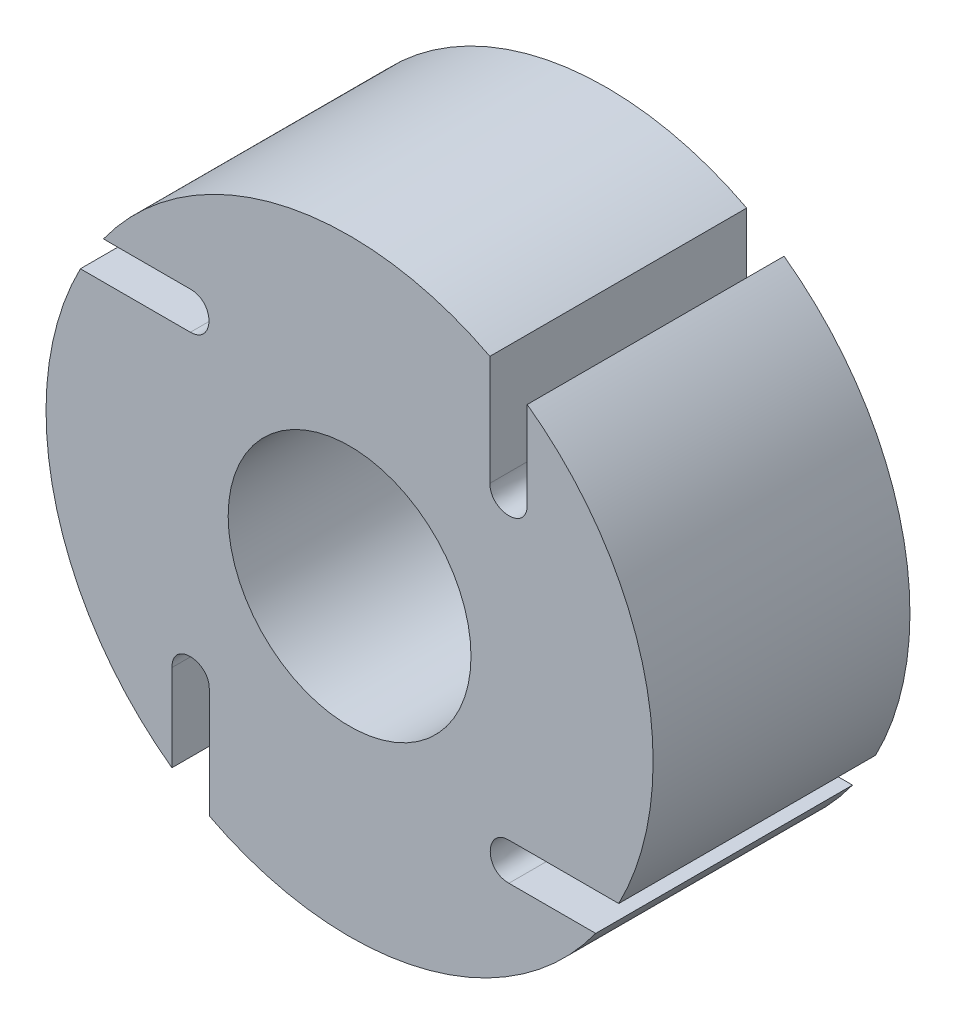
ISO-10303-21;
HEADER;
FILE_DESCRIPTION(('STEP AP214'),'2;1');
FILE_NAME('part.step','',(''),(''),'','','');
FILE_SCHEMA(('AUTOMOTIVE_DESIGN { 1 0 10303 214 1 1 1 1 }'));
ENDSEC;
DATA;
#1=APPLICATION_CONTEXT('core data for automotive mechanical design processes');
#2=APPLICATION_PROTOCOL_DEFINITION('international standard','automotive_design',2000,#1);
#3=PRODUCT_CONTEXT('',#1,'mechanical');
#4=PRODUCT('Part','Part','',(#3));
#5=PRODUCT_RELATED_PRODUCT_CATEGORY('part','',(#4));
#6=PRODUCT_DEFINITION_FORMATION('','',#4);
#7=PRODUCT_DEFINITION_CONTEXT('part definition',#1,'design');
#8=PRODUCT_DEFINITION('design','',#6,#7);
#9=PRODUCT_DEFINITION_SHAPE('','',#8);
#10=(LENGTH_UNIT() NAMED_UNIT(*) SI_UNIT(.MILLI.,.METRE.));
#11=(NAMED_UNIT(*) PLANE_ANGLE_UNIT() SI_UNIT($,.RADIAN.));
#12=(NAMED_UNIT(*) SI_UNIT($,.STERADIAN.) SOLID_ANGLE_UNIT());
#13=UNCERTAINTY_MEASURE_WITH_UNIT(LENGTH_MEASURE(1.E-05),#10,'distance_accuracy_value','');
#14=(GEOMETRIC_REPRESENTATION_CONTEXT(3) GLOBAL_UNCERTAINTY_ASSIGNED_CONTEXT((#13)) GLOBAL_UNIT_ASSIGNED_CONTEXT((#10,
#11,#12)) REPRESENTATION_CONTEXT('',''));
#15=CARTESIAN_POINT('',(0.,0.,0.));
#16=DIRECTION('',(0.,0.,1.));
#17=DIRECTION('',(1.,0.,0.));
#18=AXIS2_PLACEMENT_3D('',#15,#16,#17);
#19=CARTESIAN_POINT('',(7.16553890691274,7.3119658807004,-5.5));
#20=DIRECTION('',(0.,0.,1.));
#21=DIRECTION('',(1.,0.,0.));
#22=AXIS2_PLACEMENT_3D('',#19,#20,#21);
#23=CYLINDRICAL_SURFACE('',#22,6.5);
#24=DIRECTION('',(0.,0.,1.));
#25=VECTOR('',#24,1.);
#26=CARTESIAN_POINT('',(1.8949195940443,11.1159863931081,-5.5));
#27=LINE('',#26,#25);
#28=CARTESIAN_POINT('',(1.8949195940443,11.1159863931081,0.));
#29=VERTEX_POINT('',#28);
#30=CARTESIAN_POINT('',(1.8949195940443,11.1159863931081,-5.5));
#31=VERTEX_POINT('',#30);
#32=EDGE_CURVE('E217',#29,#31,#27,.F.);
#33=ORIENTED_EDGE('',*,*,#32,.F.);
#34=CARTESIAN_POINT('',(7.16553890691274,7.3119658807004,0.));
#35=DIRECTION('',(0.,0.,1.));
#36=DIRECTION('',(1.,0.,0.));
#37=AXIS2_PLACEMENT_3D('',#34,#35,#36);
#38=CIRCLE('',#37,6.5);
#39=CARTESIAN_POINT('',(10.1695594193204,13.0761536605211,0.));
#40=VERTEX_POINT('',#39);
#41=EDGE_CURVE('E317',#40,#29,#38,.T.);
#42=ORIENTED_EDGE('',*,*,#41,.F.);
#43=DIRECTION('',(0.,0.,1.));
#44=VECTOR('',#43,1.);
#45=CARTESIAN_POINT('',(10.1695594193204,13.0761536605211,-5.5));
#46=LINE('',#45,#44);
#47=CARTESIAN_POINT('',(10.1695594193204,13.0761536605211,-5.5));
#48=VERTEX_POINT('',#47);
#49=EDGE_CURVE('E298',#48,#40,#46,.T.);
#50=ORIENTED_EDGE('',*,*,#49,.F.);
#51=CARTESIAN_POINT('',(7.16553890691274,7.3119658807004,-5.5));
#52=DIRECTION('',(0.,0.,1.));
#53=DIRECTION('',(1.,0.,0.));
#54=AXIS2_PLACEMENT_3D('',#51,#52,#53);
#55=CIRCLE('',#54,6.5);
#56=EDGE_CURVE('E312',#48,#31,#55,.T.);
#57=ORIENTED_EDGE('',*,*,#56,.T.);
#58=EDGE_LOOP('',(#33,#42,#50,#57));
#59=FACE_BOUND('',#58,.T.);
#60=ADVANCED_FACE('F33',(#59),#23,.T.);
#61=DIRECTION('',(0.,0.,1.));
#62=VECTOR('',#61,1.);
#63=CARTESIAN_POINT('',(1.40135112709207,10.3159863931081,-5.5));
#64=LINE('',#63,#62);
#65=CARTESIAN_POINT('',(1.40135112709207,10.3159863931081,-5.5));
#66=VERTEX_POINT('',#65);
#67=CARTESIAN_POINT('',(1.40135112709207,10.3159863931081,0.));
#68=VERTEX_POINT('',#67);
#69=EDGE_CURVE('E47',#66,#68,#64,.T.);
#70=ORIENTED_EDGE('',*,*,#69,.F.);
#71=CARTESIAN_POINT('',(3.3615183945051,2.04134656783195,-5.5));
#72=VERTEX_POINT('',#71);
#73=EDGE_CURVE('E164',#66,#72,#55,.T.);
#74=ORIENTED_EDGE('',*,*,#73,.T.);
#75=DIRECTION('',(0.,0.,1.));
#76=VECTOR('',#75,1.);
#77=CARTESIAN_POINT('',(3.3615183945051,2.04134656783195,-5.5));
#78=LINE('',#77,#76);
#79=CARTESIAN_POINT('',(3.3615183945051,2.04134656783195,0.));
#80=VERTEX_POINT('',#79);
#81=EDGE_CURVE('E228',#80,#72,#78,.F.);
#82=ORIENTED_EDGE('',*,*,#81,.F.);
#83=EDGE_CURVE('E320',#68,#80,#38,.T.);
#84=ORIENTED_EDGE('',*,*,#83,.F.);
#85=EDGE_LOOP('',(#70,#74,#82,#84));
#86=FACE_BOUND('',#85,.T.);
#87=ADVANCED_FACE('F336',(#86),#23,.T.);
#88=DIRECTION('',(0.,0.,1.));
#89=VECTOR('',#88,1.);
#90=CARTESIAN_POINT('',(4.1615183945051,1.54777810087971,-5.5));
#91=LINE('',#90,#89);
#92=CARTESIAN_POINT('',(4.1615183945051,1.54777810087971,-5.5));
#93=VERTEX_POINT('',#92);
#94=CARTESIAN_POINT('',(4.1615183945051,1.54777810087971,0.));
#95=VERTEX_POINT('',#94);
#96=EDGE_CURVE('E55',#93,#95,#91,.T.);
#97=ORIENTED_EDGE('',*,*,#96,.F.);
#98=CARTESIAN_POINT('',(12.4361582197811,3.50794536829269,-5.5));
#99=VERTEX_POINT('',#98);
#100=EDGE_CURVE('E337',#93,#99,#55,.T.);
#101=ORIENTED_EDGE('',*,*,#100,.T.);
#102=DIRECTION('',(0.,0.,1.));
#103=VECTOR('',#102,1.);
#104=CARTESIAN_POINT('',(12.4361582197811,3.50794536829269,-5.5));
#105=LINE('',#104,#103);
#106=CARTESIAN_POINT('',(12.4361582197811,3.50794536829269,0.));
#107=VERTEX_POINT('',#106);
#108=EDGE_CURVE('E290',#107,#99,#105,.F.);
#109=ORIENTED_EDGE('',*,*,#108,.F.);
#110=EDGE_CURVE('E357',#95,#107,#38,.T.);
#111=ORIENTED_EDGE('',*,*,#110,.F.);
#112=EDGE_LOOP('',(#97,#101,#109,#111));
#113=FACE_BOUND('',#112,.T.);
#114=ADVANCED_FACE('F366',(#113),#23,.T.);
#115=DIRECTION('',(0.,0.,1.));
#116=VECTOR('',#115,1.);
#117=CARTESIAN_POINT('',(12.9297266867334,4.30794536829269,-5.5));
#118=LINE('',#117,#116);
#119=CARTESIAN_POINT('',(12.9297266867334,4.30794536829269,-5.5));
#120=VERTEX_POINT('',#119);
#121=CARTESIAN_POINT('',(12.9297266867334,4.30794536829269,0.));
#122=VERTEX_POINT('',#121);
#123=EDGE_CURVE('E347',#120,#122,#118,.T.);
#124=ORIENTED_EDGE('',*,*,#123,.F.);
#125=CARTESIAN_POINT('',(10.9695594193204,12.5825851935688,-5.5));
#126=VERTEX_POINT('',#125);
#127=EDGE_CURVE('E316',#120,#126,#55,.T.);
#128=ORIENTED_EDGE('',*,*,#127,.T.);
#129=DIRECTION('',(0.,0.,1.));
#130=VECTOR('',#129,1.);
#131=CARTESIAN_POINT('',(10.9695594193204,12.5825851935688,-5.5));
#132=LINE('',#131,#130);
#133=CARTESIAN_POINT('',(10.9695594193204,12.5825851935688,0.));
#134=VERTEX_POINT('',#133);
#135=EDGE_CURVE('E302',#134,#126,#132,.F.);
#136=ORIENTED_EDGE('',*,*,#135,.F.);
#137=EDGE_CURVE('E309',#122,#134,#38,.T.);
#138=ORIENTED_EDGE('',*,*,#137,.F.);
#139=EDGE_LOOP('',(#124,#128,#136,#138));
#140=FACE_BOUND('',#139,.T.);
#141=ADVANCED_FACE('F35',(#140),#23,.T.);
#142=CARTESIAN_POINT('',(7.16553890691274,7.3119658807004,-5.5));
#143=DIRECTION('',(0.,0.,1.));
#144=DIRECTION('',(1.,0.,0.));
#145=AXIS2_PLACEMENT_3D('',#142,#143,#144);
#146=PLANE('',#145);
#147=CARTESIAN_POINT('',(7.16553890691274,7.3119658807004,-5.5));
#148=DIRECTION('',(0.,0.,1.));
#149=DIRECTION('',(1.,0.,0.));
#150=AXIS2_PLACEMENT_3D('',#147,#148,#149);
#151=CIRCLE('',#150,2.6);
#152=CARTESIAN_POINT('',(9.76553890691274,7.3119658807004,-5.5));
#153=VERTEX_POINT('',#152);
#154=EDGE_CURVE('E306',#153,#153,#151,.T.);
#155=ORIENTED_EDGE('',*,*,#154,.T.);
#156=EDGE_LOOP('',(#155));
#157=FACE_BOUND('',#156,.T.);
#158=CARTESIAN_POINT('',(3.7563901333758,10.315986393108,-5.5));
#159=CARTESIAN_POINT('',(4.26558371174285,10.315986393108,-5.5));
#160=CARTESIAN_POINT('',(4.3066364519543,11.115986393108,-5.5));
#161=CARTESIAN_POINT('',(3.75373354022195,11.115986393108,-5.5));
#162=B_SPLINE_CURVE_WITH_KNOTS('',3,(#158,#159,#160,#161),.UNSPECIFIED.,.F.,.F.,(4,4),(0.,1.),.UNSPECIFIED.);
#163=CARTESIAN_POINT('',(3.7563901333758,10.315986393108,-5.5));
#164=VERTEX_POINT('',#163);
#165=CARTESIAN_POINT('',(3.75373354022198,11.115986393108,-5.5));
#166=VERTEX_POINT('',#165);
#167=EDGE_CURVE('E155',#164,#166,#162,.T.);
#168=ORIENTED_EDGE('',*,*,#167,.T.);
#169=DIRECTION('',(-1.,0.,0.));
#170=VECTOR('',#169,1.);
#171=CARTESIAN_POINT('',(3.75373354022198,11.115986393108,-5.5));
#172=LINE('',#171,#170);
#173=EDGE_CURVE('E152',#166,#31,#172,.T.);
#174=ORIENTED_EDGE('',*,*,#173,.T.);
#175=ORIENTED_EDGE('',*,*,#56,.F.);
#176=DIRECTION('',(0.,-1.,0.));
#177=VECTOR('',#176,1.);
#178=CARTESIAN_POINT('',(10.1695594193204,13.2154913280105,-5.5));
#179=LINE('',#178,#177);
#180=CARTESIAN_POINT('',(10.1695594193204,10.7211146542373,-5.5));
#181=VERTEX_POINT('',#180);
#182=EDGE_CURVE('E276',#48,#181,#179,.T.);
#183=ORIENTED_EDGE('',*,*,#182,.T.);
#184=CARTESIAN_POINT('',(10.1695594193204,10.7211146542373,-5.5));
#185=CARTESIAN_POINT('',(10.1695594193204,10.2119210758703,-5.5));
#186=CARTESIAN_POINT('',(10.9695594193204,10.1708683356588,-5.5));
#187=CARTESIAN_POINT('',(10.9695594193204,10.7237712473912,-5.5));
#188=B_SPLINE_CURVE_WITH_KNOTS('',3,(#184,#185,#186,#187),.UNSPECIFIED.,.F.,.F.,(4,4),(0.,1.),.UNSPECIFIED.);
#189=CARTESIAN_POINT('',(10.9695594193204,10.7237712473912,-5.5));
#190=VERTEX_POINT('',#189);
#191=EDGE_CURVE('E268',#181,#190,#188,.T.);
#192=ORIENTED_EDGE('',*,*,#191,.T.);
#193=DIRECTION('',(0.,1.,0.));
#194=VECTOR('',#193,1.);
#195=CARTESIAN_POINT('',(10.9695594193204,10.7237712473912,-5.5));
#196=LINE('',#195,#194);
#197=EDGE_CURVE('E275',#190,#126,#196,.T.);
#198=ORIENTED_EDGE('',*,*,#197,.T.);
#199=ORIENTED_EDGE('',*,*,#127,.F.);
#200=DIRECTION('',(-1.,0.,0.));
#201=VECTOR('',#200,1.);
#202=CARTESIAN_POINT('',(13.0690643542229,4.30794536829269,-5.5));
#203=LINE('',#202,#201);
#204=CARTESIAN_POINT('',(10.5746876804498,4.30794536829271,-5.5));
#205=VERTEX_POINT('',#204);
#206=EDGE_CURVE('E232',#120,#205,#203,.T.);
#207=ORIENTED_EDGE('',*,*,#206,.T.);
#208=CARTESIAN_POINT('',(10.5746876804498,4.30794536829271,-5.5));
#209=CARTESIAN_POINT('',(10.0654941020827,4.30794536829271,-5.5));
#210=CARTESIAN_POINT('',(10.0244413618713,3.50794536829271,-5.5));
#211=CARTESIAN_POINT('',(10.5773442736036,3.50794536829271,-5.5));
#212=B_SPLINE_CURVE_WITH_KNOTS('',3,(#208,#209,#210,#211),.UNSPECIFIED.,.F.,.F.,(4,4),(0.,1.),.UNSPECIFIED.);
#213=CARTESIAN_POINT('',(10.5773442736036,3.5079453682927,-5.5));
#214=VERTEX_POINT('',#213);
#215=EDGE_CURVE('E235',#205,#214,#212,.T.);
#216=ORIENTED_EDGE('',*,*,#215,.T.);
#217=DIRECTION('',(1.,0.,0.));
#218=VECTOR('',#217,1.);
#219=CARTESIAN_POINT('',(10.5773442736036,3.5079453682927,-5.5));
#220=LINE('',#219,#218);
#221=EDGE_CURVE('E242',#214,#99,#220,.T.);
#222=ORIENTED_EDGE('',*,*,#221,.T.);
#223=ORIENTED_EDGE('',*,*,#100,.F.);
#224=DIRECTION('',(0.,1.,0.));
#225=VECTOR('',#224,1.);
#226=CARTESIAN_POINT('',(4.1615183945051,1.40844043339028,-5.5));
#227=LINE('',#226,#225);
#228=CARTESIAN_POINT('',(4.16151839450514,3.90281710716338,-5.5));
#229=VERTEX_POINT('',#228);
#230=EDGE_CURVE('E204',#93,#229,#227,.T.);
#231=ORIENTED_EDGE('',*,*,#230,.T.);
#232=CARTESIAN_POINT('',(4.16151839450514,3.90281710716338,-5.5));
#233=CARTESIAN_POINT('',(4.16151839450514,4.41201068553042,-5.5));
#234=CARTESIAN_POINT('',(3.36151839450514,4.45306342574187,-5.5));
#235=CARTESIAN_POINT('',(3.36151839450514,3.90016051400952,-5.5));
#236=B_SPLINE_CURVE_WITH_KNOTS('',3,(#232,#233,#234,#235),.UNSPECIFIED.,.F.,.F.,(4,4),(0.,1.),.UNSPECIFIED.);
#237=CARTESIAN_POINT('',(3.36151839450512,3.90016051400955,-5.5));
#238=VERTEX_POINT('',#237);
#239=EDGE_CURVE('E196',#229,#238,#236,.T.);
#240=ORIENTED_EDGE('',*,*,#239,.T.);
#241=DIRECTION('',(0.,-1.,0.));
#242=VECTOR('',#241,1.);
#243=CARTESIAN_POINT('',(3.36151839450512,3.90016051400955,-5.5));
#244=LINE('',#243,#242);
#245=EDGE_CURVE('E203',#238,#72,#244,.T.);
#246=ORIENTED_EDGE('',*,*,#245,.T.);
#247=ORIENTED_EDGE('',*,*,#73,.F.);
#248=DIRECTION('',(1.,0.,0.));
#249=VECTOR('',#248,1.);
#250=CARTESIAN_POINT('',(1.26201345960271,10.3159863931081,-5.5));
#251=LINE('',#250,#249);
#252=EDGE_CURVE('E147',#66,#164,#251,.T.);
#253=ORIENTED_EDGE('',*,*,#252,.T.);
#254=EDGE_LOOP('',(#168,#174,#175,#183,#192,#198,#199,#207,#216,#222,#223,#231,#240,#246,#247,#253));
#255=FACE_BOUND('',#254,.T.);
#256=ADVANCED_FACE('F162',(#157,#255),#146,.F.);
#257=CARTESIAN_POINT('',(7.16553890691274,7.3119658807004,0.));
#258=DIRECTION('',(0.,0.,1.));
#259=DIRECTION('',(1.,0.,0.));
#260=AXIS2_PLACEMENT_3D('',#257,#258,#259);
#261=PLANE('',#260);
#262=DIRECTION('',(-1.,0.,0.));
#263=VECTOR('',#262,1.);
#264=CARTESIAN_POINT('',(3.75373354022198,11.115986393108,0.));
#265=LINE('',#264,#263);
#266=CARTESIAN_POINT('',(3.75373354022198,11.115986393108,0.));
#267=VERTEX_POINT('',#266);
#268=EDGE_CURVE('E165',#267,#29,#265,.T.);
#269=ORIENTED_EDGE('',*,*,#268,.F.);
#270=CARTESIAN_POINT('',(3.7563901333758,10.315986393108,0.));
#271=CARTESIAN_POINT('',(4.26558371174285,10.315986393108,0.));
#272=CARTESIAN_POINT('',(4.3066364519543,11.115986393108,0.));
#273=CARTESIAN_POINT('',(3.75373354022195,11.115986393108,0.));
#274=B_SPLINE_CURVE_WITH_KNOTS('',3,(#270,#271,#272,#273),.UNSPECIFIED.,.F.,.F.,(4,4),(0.,1.),.UNSPECIFIED.);
#275=CARTESIAN_POINT('',(3.7563901333758,10.315986393108,0.));
#276=VERTEX_POINT('',#275);
#277=EDGE_CURVE('E167',#276,#267,#274,.T.);
#278=ORIENTED_EDGE('',*,*,#277,.F.);
#279=DIRECTION('',(1.,0.,0.));
#280=VECTOR('',#279,1.);
#281=CARTESIAN_POINT('',(7.16553890691277,10.315986393108,0.));
#282=LINE('',#281,#280);
#283=EDGE_CURVE('E11',#68,#276,#282,.T.);
#284=ORIENTED_EDGE('',*,*,#283,.F.);
#285=ORIENTED_EDGE('',*,*,#83,.T.);
#286=DIRECTION('',(0.,-1.,0.));
#287=VECTOR('',#286,1.);
#288=CARTESIAN_POINT('',(3.36151839450512,3.90016051400955,0.));
#289=LINE('',#288,#287);
#290=CARTESIAN_POINT('',(3.36151839450512,3.90016051400955,0.));
#291=VERTEX_POINT('',#290);
#292=EDGE_CURVE('E216',#291,#80,#289,.T.);
#293=ORIENTED_EDGE('',*,*,#292,.F.);
#294=CARTESIAN_POINT('',(4.16151839450514,3.90281710716338,0.));
#295=CARTESIAN_POINT('',(4.16151839450514,4.41201068553042,0.));
#296=CARTESIAN_POINT('',(3.36151839450514,4.45306342574187,0.));
#297=CARTESIAN_POINT('',(3.36151839450514,3.90016051400952,0.));
#298=B_SPLINE_CURVE_WITH_KNOTS('',3,(#294,#295,#296,#297),.UNSPECIFIED.,.F.,.F.,(4,4),(0.,1.),.UNSPECIFIED.);
#299=CARTESIAN_POINT('',(4.16151839450514,3.90281710716338,0.));
#300=VERTEX_POINT('',#299);
#301=EDGE_CURVE('E211',#300,#291,#298,.T.);
#302=ORIENTED_EDGE('',*,*,#301,.F.);
#303=DIRECTION('',(0.,1.,0.));
#304=VECTOR('',#303,1.);
#305=CARTESIAN_POINT('',(4.16151839450514,7.31196588070042,0.));
#306=LINE('',#305,#304);
#307=EDGE_CURVE('E41',#95,#300,#306,.T.);
#308=ORIENTED_EDGE('',*,*,#307,.F.);
#309=ORIENTED_EDGE('',*,*,#110,.T.);
#310=DIRECTION('',(1.,0.,0.));
#311=VECTOR('',#310,1.);
#312=CARTESIAN_POINT('',(10.5773442736036,3.5079453682927,0.));
#313=LINE('',#312,#311);
#314=CARTESIAN_POINT('',(10.5773442736036,3.5079453682927,0.));
#315=VERTEX_POINT('',#314);
#316=EDGE_CURVE('E236',#315,#107,#313,.T.);
#317=ORIENTED_EDGE('',*,*,#316,.F.);
#318=CARTESIAN_POINT('',(10.5746876804498,4.30794536829271,0.));
#319=CARTESIAN_POINT('',(10.0654941020827,4.30794536829271,0.));
#320=CARTESIAN_POINT('',(10.0244413618713,3.50794536829271,0.));
#321=CARTESIAN_POINT('',(10.5773442736036,3.50794536829271,0.));
#322=B_SPLINE_CURVE_WITH_KNOTS('',3,(#318,#319,#320,#321),.UNSPECIFIED.,.F.,.F.,(4,4),(0.,1.),.UNSPECIFIED.);
#323=CARTESIAN_POINT('',(10.5746876804498,4.30794536829271,0.));
#324=VERTEX_POINT('',#323);
#325=EDGE_CURVE('E231',#324,#315,#322,.T.);
#326=ORIENTED_EDGE('',*,*,#325,.F.);
#327=DIRECTION('',(-1.,0.,0.));
#328=VECTOR('',#327,1.);
#329=CARTESIAN_POINT('',(7.16553890691273,4.30794536829271,0.));
#330=LINE('',#329,#328);
#331=EDGE_CURVE('E322',#122,#324,#330,.T.);
#332=ORIENTED_EDGE('',*,*,#331,.F.);
#333=ORIENTED_EDGE('',*,*,#137,.T.);
#334=DIRECTION('',(0.,1.,0.));
#335=VECTOR('',#334,1.);
#336=CARTESIAN_POINT('',(10.9695594193204,10.7237712473912,0.));
#337=LINE('',#336,#335);
#338=CARTESIAN_POINT('',(10.9695594193204,10.7237712473912,0.));
#339=VERTEX_POINT('',#338);
#340=EDGE_CURVE('E289',#339,#134,#337,.T.);
#341=ORIENTED_EDGE('',*,*,#340,.F.);
#342=CARTESIAN_POINT('',(10.1695594193204,10.7211146542373,0.));
#343=CARTESIAN_POINT('',(10.1695594193204,10.2119210758703,0.));
#344=CARTESIAN_POINT('',(10.9695594193204,10.1708683356588,0.));
#345=CARTESIAN_POINT('',(10.9695594193204,10.7237712473912,0.));
#346=B_SPLINE_CURVE_WITH_KNOTS('',3,(#342,#343,#344,#345),.UNSPECIFIED.,.F.,.F.,(4,4),(0.,1.),.UNSPECIFIED.);
#347=CARTESIAN_POINT('',(10.1695594193204,10.7211146542373,0.));
#348=VERTEX_POINT('',#347);
#349=EDGE_CURVE('E284',#348,#339,#346,.T.);
#350=ORIENTED_EDGE('',*,*,#349,.F.);
#351=DIRECTION('',(0.,-1.,0.));
#352=VECTOR('',#351,1.);
#353=CARTESIAN_POINT('',(10.1695594193204,7.3119658807004,0.));
#354=LINE('',#353,#352);
#355=EDGE_CURVE('E315',#40,#348,#354,.T.);
#356=ORIENTED_EDGE('',*,*,#355,.F.);
#357=ORIENTED_EDGE('',*,*,#41,.T.);
#358=EDGE_LOOP('',(#269,#278,#284,#285,#293,#302,#308,#309,#317,#326,#332,#333,#341,#350,#356,#357));
#359=FACE_BOUND('',#358,.T.);
#360=CARTESIAN_POINT('',(7.16553890691274,7.3119658807004,0.));
#361=DIRECTION('',(0.,0.,1.));
#362=DIRECTION('',(1.,0.,0.));
#363=AXIS2_PLACEMENT_3D('',#360,#361,#362);
#364=CIRCLE('',#363,2.6);
#365=CARTESIAN_POINT('',(9.76553890691274,7.3119658807004,0.));
#366=VERTEX_POINT('',#365);
#367=EDGE_CURVE('E305',#366,#366,#364,.T.);
#368=ORIENTED_EDGE('',*,*,#367,.F.);
#369=EDGE_LOOP('',(#368));
#370=FACE_BOUND('',#369,.T.);
#371=ADVANCED_FACE('F330',(#359,#370),#261,.T.);
#372=CARTESIAN_POINT('',(7.16553890691274,7.3119658807004,-5.5));
#373=DIRECTION('',(0.,0.,1.));
#374=DIRECTION('',(1.,0.,0.));
#375=AXIS2_PLACEMENT_3D('',#372,#373,#374);
#376=CYLINDRICAL_SURFACE('',#375,2.6);
#377=ORIENTED_EDGE('',*,*,#154,.F.);
#378=EDGE_LOOP('',(#377));
#379=FACE_BOUND('',#378,.T.);
#380=ORIENTED_EDGE('',*,*,#367,.T.);
#381=EDGE_LOOP('',(#380));
#382=FACE_BOUND('',#381,.T.);
#383=ADVANCED_FACE('F260',(#379,#382),#376,.F.);
#384=CARTESIAN_POINT('',(10.9695594193204,10.7237712473912,-5.5));
#385=DIRECTION('',(1.,0.,0.));
#386=DIRECTION('',(0.,0.,-1.));
#387=AXIS2_PLACEMENT_3D('',#384,#385,#386);
#388=PLANE('',#387);
#389=ORIENTED_EDGE('',*,*,#135,.T.);
#390=ORIENTED_EDGE('',*,*,#197,.F.);
#391=DIRECTION('',(0.,0.,1.));
#392=VECTOR('',#391,1.);
#393=CARTESIAN_POINT('',(10.9695594193204,10.7237712473912,-5.5));
#394=LINE('',#393,#392);
#395=EDGE_CURVE('E296',#190,#339,#394,.T.);
#396=ORIENTED_EDGE('',*,*,#395,.T.);
#397=ORIENTED_EDGE('',*,*,#340,.T.);
#398=EDGE_LOOP('',(#389,#390,#396,#397));
#399=FACE_BOUND('',#398,.T.);
#400=ADVANCED_FACE('F256',(#399),#388,.F.);
#401=DIRECTION('',(0.,0.,1.));
#402=VECTOR('',#401,1.);
#403=SURFACE_OF_LINEAR_EXTRUSION('',#188,#402);
#404=ORIENTED_EDGE('',*,*,#349,.T.);
#405=ORIENTED_EDGE('',*,*,#395,.F.);
#406=ORIENTED_EDGE('',*,*,#191,.F.);
#407=DIRECTION('',(0.,0.,1.));
#408=VECTOR('',#407,1.);
#409=CARTESIAN_POINT('',(10.1695594193204,10.7211146542373,-5.5));
#410=LINE('',#409,#408);
#411=EDGE_CURVE('E283',#181,#348,#410,.T.);
#412=ORIENTED_EDGE('',*,*,#411,.T.);
#413=EDGE_LOOP('',(#404,#405,#406,#412));
#414=FACE_BOUND('',#413,.T.);
#415=ADVANCED_FACE('F259',(#414),#403,.F.);
#416=CARTESIAN_POINT('',(10.1695594193204,13.2154913280105,-5.5));
#417=DIRECTION('',(-1.,0.,0.));
#418=DIRECTION('',(0.,0.,1.));
#419=AXIS2_PLACEMENT_3D('',#416,#417,#418);
#420=PLANE('',#419);
#421=ORIENTED_EDGE('',*,*,#49,.T.);
#422=ORIENTED_EDGE('',*,*,#355,.T.);
#423=ORIENTED_EDGE('',*,*,#411,.F.);
#424=ORIENTED_EDGE('',*,*,#182,.F.);
#425=EDGE_LOOP('',(#421,#422,#423,#424));
#426=FACE_BOUND('',#425,.T.);
#427=ADVANCED_FACE('F265',(#426),#420,.F.);
#428=CARTESIAN_POINT('',(10.5773442736036,3.5079453682927,-5.5));
#429=DIRECTION('',(0.,-1.,0.));
#430=DIRECTION('',(1.,0.,0.));
#431=AXIS2_PLACEMENT_3D('',#428,#429,#430);
#432=PLANE('',#431);
#433=ORIENTED_EDGE('',*,*,#108,.T.);
#434=ORIENTED_EDGE('',*,*,#221,.F.);
#435=DIRECTION('',(0.,0.,1.));
#436=VECTOR('',#435,1.);
#437=CARTESIAN_POINT('',(10.5773442736036,3.5079453682927,-5.5));
#438=LINE('',#437,#436);
#439=EDGE_CURVE('E363',#214,#315,#438,.T.);
#440=ORIENTED_EDGE('',*,*,#439,.T.);
#441=ORIENTED_EDGE('',*,*,#316,.T.);
#442=EDGE_LOOP('',(#433,#434,#440,#441));
#443=FACE_BOUND('',#442,.T.);
#444=ADVANCED_FACE('F251',(#443),#432,.F.);
#445=DIRECTION('',(0.,0.,1.));
#446=VECTOR('',#445,1.);
#447=SURFACE_OF_LINEAR_EXTRUSION('',#212,#446);
#448=ORIENTED_EDGE('',*,*,#325,.T.);
#449=ORIENTED_EDGE('',*,*,#439,.F.);
#450=ORIENTED_EDGE('',*,*,#215,.F.);
#451=DIRECTION('',(0.,0.,1.));
#452=VECTOR('',#451,1.);
#453=CARTESIAN_POINT('',(10.5746876804498,4.30794536829271,-5.5));
#454=LINE('',#453,#452);
#455=EDGE_CURVE('E369',#205,#324,#454,.T.);
#456=ORIENTED_EDGE('',*,*,#455,.T.);
#457=EDGE_LOOP('',(#448,#449,#450,#456));
#458=FACE_BOUND('',#457,.T.);
#459=ADVANCED_FACE('F248',(#458),#447,.F.);
#460=CARTESIAN_POINT('',(13.0690643542229,4.30794536829269,-5.5));
#461=DIRECTION('',(0.,1.,0.));
#462=DIRECTION('',(-1.,0.,0.));
#463=AXIS2_PLACEMENT_3D('',#460,#461,#462);
#464=PLANE('',#463);
#465=ORIENTED_EDGE('',*,*,#123,.T.);
#466=ORIENTED_EDGE('',*,*,#331,.T.);
#467=ORIENTED_EDGE('',*,*,#455,.F.);
#468=ORIENTED_EDGE('',*,*,#206,.F.);
#469=EDGE_LOOP('',(#465,#466,#467,#468));
#470=FACE_BOUND('',#469,.T.);
#471=ADVANCED_FACE('F188',(#470),#464,.F.);
#472=CARTESIAN_POINT('',(3.36151839450512,3.90016051400955,-5.5));
#473=DIRECTION('',(-1.,0.,0.));
#474=DIRECTION('',(0.,-1.,0.));
#475=AXIS2_PLACEMENT_3D('',#472,#473,#474);
#476=PLANE('',#475);
#477=ORIENTED_EDGE('',*,*,#81,.T.);
#478=ORIENTED_EDGE('',*,*,#245,.F.);
#479=DIRECTION('',(0.,0.,1.));
#480=VECTOR('',#479,1.);
#481=CARTESIAN_POINT('',(3.36151839450512,3.90016051400955,-5.5));
#482=LINE('',#481,#480);
#483=EDGE_CURVE('E223',#238,#291,#482,.T.);
#484=ORIENTED_EDGE('',*,*,#483,.T.);
#485=ORIENTED_EDGE('',*,*,#292,.T.);
#486=EDGE_LOOP('',(#477,#478,#484,#485));
#487=FACE_BOUND('',#486,.T.);
#488=ADVANCED_FACE('F184',(#487),#476,.F.);
#489=DIRECTION('',(0.,0.,1.));
#490=VECTOR('',#489,1.);
#491=SURFACE_OF_LINEAR_EXTRUSION('',#236,#490);
#492=ORIENTED_EDGE('',*,*,#301,.T.);
#493=ORIENTED_EDGE('',*,*,#483,.F.);
#494=ORIENTED_EDGE('',*,*,#239,.F.);
#495=DIRECTION('',(0.,0.,1.));
#496=VECTOR('',#495,1.);
#497=CARTESIAN_POINT('',(4.16151839450514,3.90281710716338,-5.5));
#498=LINE('',#497,#496);
#499=EDGE_CURVE('E210',#229,#300,#498,.T.);
#500=ORIENTED_EDGE('',*,*,#499,.T.);
#501=EDGE_LOOP('',(#492,#493,#494,#500));
#502=FACE_BOUND('',#501,.T.);
#503=ADVANCED_FACE('F187',(#502),#491,.F.);
#504=CARTESIAN_POINT('',(4.1615183945051,1.40844043339028,-5.5));
#505=DIRECTION('',(1.,0.,0.));
#506=DIRECTION('',(0.,1.,0.));
#507=AXIS2_PLACEMENT_3D('',#504,#505,#506);
#508=PLANE('',#507);
#509=ORIENTED_EDGE('',*,*,#96,.T.);
#510=ORIENTED_EDGE('',*,*,#307,.T.);
#511=ORIENTED_EDGE('',*,*,#499,.F.);
#512=ORIENTED_EDGE('',*,*,#230,.F.);
#513=EDGE_LOOP('',(#509,#510,#511,#512));
#514=FACE_BOUND('',#513,.T.);
#515=ADVANCED_FACE('F193',(#514),#508,.F.);
#516=CARTESIAN_POINT('',(3.75373354022198,11.115986393108,-5.5));
#517=DIRECTION('',(0.,1.,0.));
#518=DIRECTION('',(-1.,0.,0.));
#519=AXIS2_PLACEMENT_3D('',#516,#517,#518);
#520=PLANE('',#519);
#521=ORIENTED_EDGE('',*,*,#32,.T.);
#522=ORIENTED_EDGE('',*,*,#173,.F.);
#523=DIRECTION('',(0.,0.,1.));
#524=VECTOR('',#523,1.);
#525=CARTESIAN_POINT('',(3.75373354022198,11.115986393108,-5.5));
#526=LINE('',#525,#524);
#527=EDGE_CURVE('E151',#166,#267,#526,.T.);
#528=ORIENTED_EDGE('',*,*,#527,.T.);
#529=ORIENTED_EDGE('',*,*,#268,.T.);
#530=EDGE_LOOP('',(#521,#522,#528,#529));
#531=FACE_BOUND('',#530,.T.);
#532=ADVANCED_FACE('F181',(#531),#520,.F.);
#533=DIRECTION('',(0.,0.,1.));
#534=VECTOR('',#533,1.);
#535=SURFACE_OF_LINEAR_EXTRUSION('',#162,#534);
#536=ORIENTED_EDGE('',*,*,#277,.T.);
#537=ORIENTED_EDGE('',*,*,#527,.F.);
#538=ORIENTED_EDGE('',*,*,#167,.F.);
#539=DIRECTION('',(0.,0.,1.));
#540=VECTOR('',#539,1.);
#541=CARTESIAN_POINT('',(3.7563901333758,10.315986393108,-5.5));
#542=LINE('',#541,#540);
#543=EDGE_CURVE('E143',#164,#276,#542,.T.);
#544=ORIENTED_EDGE('',*,*,#543,.T.);
#545=EDGE_LOOP('',(#536,#537,#538,#544));
#546=FACE_BOUND('',#545,.T.);
#547=ADVANCED_FACE('F156',(#546),#535,.F.);
#548=CARTESIAN_POINT('',(1.26201345960271,10.3159863931081,-5.5));
#549=DIRECTION('',(0.,-1.,0.));
#550=DIRECTION('',(1.,0.,0.));
#551=AXIS2_PLACEMENT_3D('',#548,#549,#550);
#552=PLANE('',#551);
#553=ORIENTED_EDGE('',*,*,#69,.T.);
#554=ORIENTED_EDGE('',*,*,#283,.T.);
#555=ORIENTED_EDGE('',*,*,#543,.F.);
#556=ORIENTED_EDGE('',*,*,#252,.F.);
#557=EDGE_LOOP('',(#553,#554,#555,#556));
#558=FACE_BOUND('',#557,.T.);
#559=ADVANCED_FACE('F145',(#558),#552,.F.);
#560=CLOSED_SHELL('',(#60,#87,#114,#141,#256,#371,#383,#400,#415,#427,#444,#459,#471,#488,#503,
#515,#532,#547,#559));
#561=MANIFOLD_SOLID_BREP('B2',#560);
#562=ADVANCED_BREP_SHAPE_REPRESENTATION('',(#18,#561),#14);
#563=SHAPE_DEFINITION_REPRESENTATION(#9,#562);
ENDSEC;
END-ISO-10303-21;
